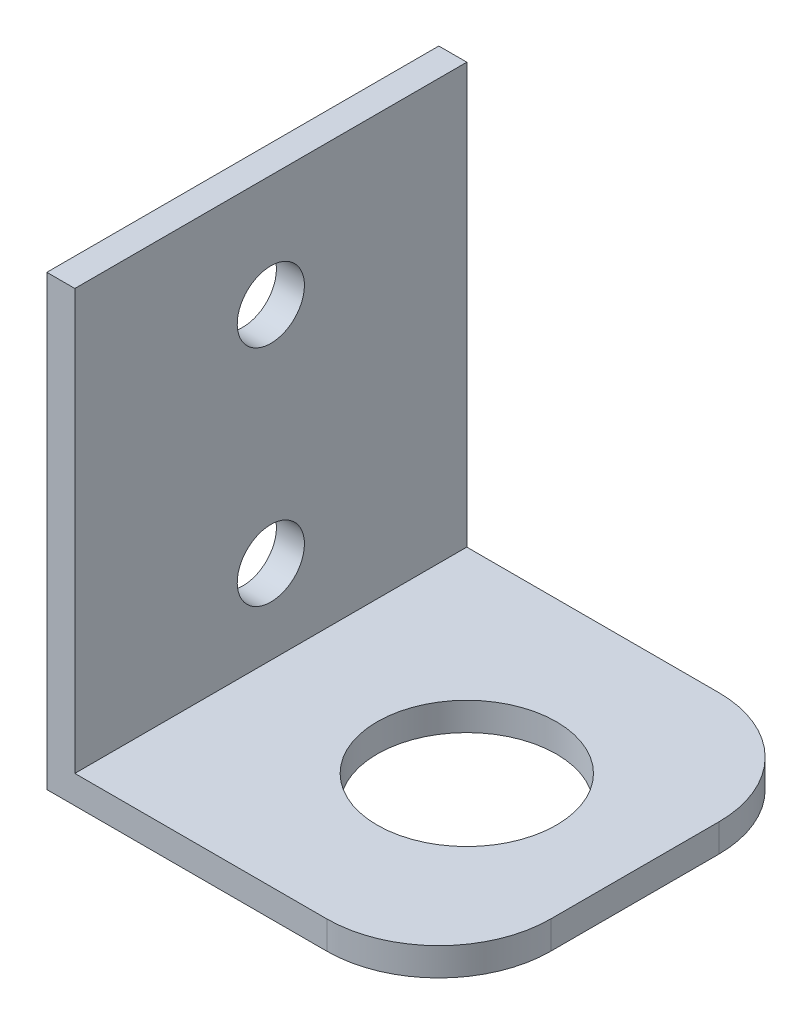
ISO-10303-21;
HEADER;
FILE_DESCRIPTION(('STEP AP214'),'2;1');
FILE_NAME('part.step','',(''),(''),'','','');
FILE_SCHEMA(('AUTOMOTIVE_DESIGN { 1 0 10303 214 1 1 1 1 }'));
ENDSEC;
DATA;
#1=APPLICATION_CONTEXT('core data for automotive mechanical design processes');
#2=APPLICATION_PROTOCOL_DEFINITION('international standard','automotive_design',2000,#1);
#3=PRODUCT_CONTEXT('',#1,'mechanical');
#4=PRODUCT('Part','Part','',(#3));
#5=PRODUCT_RELATED_PRODUCT_CATEGORY('part','',(#4));
#6=PRODUCT_DEFINITION_FORMATION('','',#4);
#7=PRODUCT_DEFINITION_CONTEXT('part definition',#1,'design');
#8=PRODUCT_DEFINITION('design','',#6,#7);
#9=PRODUCT_DEFINITION_SHAPE('','',#8);
#10=(LENGTH_UNIT() NAMED_UNIT(*) SI_UNIT(.MILLI.,.METRE.));
#11=(NAMED_UNIT(*) PLANE_ANGLE_UNIT() SI_UNIT($,.RADIAN.));
#12=(NAMED_UNIT(*) SI_UNIT($,.STERADIAN.) SOLID_ANGLE_UNIT());
#13=UNCERTAINTY_MEASURE_WITH_UNIT(LENGTH_MEASURE(1.E-05),#10,'distance_accuracy_value','');
#14=(GEOMETRIC_REPRESENTATION_CONTEXT(3) GLOBAL_UNCERTAINTY_ASSIGNED_CONTEXT((#13)) GLOBAL_UNIT_ASSIGNED_CONTEXT((#10,
#11,#12)) REPRESENTATION_CONTEXT('',''));
#15=CARTESIAN_POINT('',(0.,0.,0.));
#16=DIRECTION('',(0.,0.,1.));
#17=DIRECTION('',(1.,0.,0.));
#18=AXIS2_PLACEMENT_3D('',#15,#16,#17);
#19=CARTESIAN_POINT('',(-2.5,0.,35.));
#20=DIRECTION('',(0.,-1.,0.));
#21=DIRECTION('',(0.,0.,-1.));
#22=AXIS2_PLACEMENT_3D('',#19,#20,#21);
#23=PLANE('',#22);
#24=DIRECTION('',(-1.,0.,0.));
#25=VECTOR('',#24,1.);
#26=CARTESIAN_POINT('',(-2.5,0.,0.));
#27=LINE('',#26,#25);
#28=CARTESIAN_POINT('',(0.,0.,0.));
#29=VERTEX_POINT('',#28);
#30=CARTESIAN_POINT('',(-2.5,0.,0.));
#31=VERTEX_POINT('',#30);
#32=EDGE_CURVE('E127',#29,#31,#27,.T.);
#33=ORIENTED_EDGE('',*,*,#32,.T.);
#34=DIRECTION('',(0.,0.,-1.));
#35=VECTOR('',#34,1.);
#36=CARTESIAN_POINT('',(-2.5,0.,35.));
#37=LINE('',#36,#35);
#38=CARTESIAN_POINT('',(-2.5,0.,35.));
#39=VERTEX_POINT('',#38);
#40=EDGE_CURVE('E109',#39,#31,#37,.T.);
#41=ORIENTED_EDGE('',*,*,#40,.F.);
#42=DIRECTION('',(-1.,0.,0.));
#43=VECTOR('',#42,1.);
#44=CARTESIAN_POINT('',(-2.5,0.,35.));
#45=LINE('',#44,#43);
#46=CARTESIAN_POINT('',(0.,0.,35.));
#47=VERTEX_POINT('',#46);
#48=EDGE_CURVE('E115',#47,#39,#45,.T.);
#49=ORIENTED_EDGE('',*,*,#48,.F.);
#50=DIRECTION('',(0.,0.,-1.));
#51=VECTOR('',#50,1.);
#52=CARTESIAN_POINT('',(0.,0.,35.));
#53=LINE('',#52,#51);
#54=EDGE_CURVE('E173',#47,#29,#53,.T.);
#55=ORIENTED_EDGE('',*,*,#54,.T.);
#56=EDGE_LOOP('',(#33,#41,#49,#55));
#57=FACE_BOUND('',#56,.T.);
#58=ADVANCED_FACE('F36',(#57),#23,.F.);
#59=CARTESIAN_POINT('',(-2.5,-40.,35.));
#60=DIRECTION('',(1.,0.,0.));
#61=DIRECTION('',(0.,0.,-1.));
#62=AXIS2_PLACEMENT_3D('',#59,#60,#61);
#63=PLANE('',#62);
#64=CARTESIAN_POINT('',(-2.5,-10.,17.5));
#65=DIRECTION('',(1.,0.,0.));
#66=DIRECTION('',(0.,0.,-1.));
#67=AXIS2_PLACEMENT_3D('',#64,#65,#66);
#68=CIRCLE('',#67,3.);
#69=CARTESIAN_POINT('',(-2.5,-10.,14.5));
#70=VERTEX_POINT('',#69);
#71=EDGE_CURVE('E233',#70,#70,#68,.T.);
#72=ORIENTED_EDGE('',*,*,#71,.T.);
#73=EDGE_LOOP('',(#72));
#74=FACE_BOUND('',#73,.T.);
#75=CARTESIAN_POINT('',(-2.5,-30.,17.5));
#76=DIRECTION('',(1.,0.,0.));
#77=DIRECTION('',(0.,0.,-1.));
#78=AXIS2_PLACEMENT_3D('',#75,#76,#77);
#79=CIRCLE('',#78,3.);
#80=CARTESIAN_POINT('',(-2.5,-30.,14.5));
#81=VERTEX_POINT('',#80);
#82=EDGE_CURVE('E234',#81,#81,#79,.T.);
#83=ORIENTED_EDGE('',*,*,#82,.T.);
#84=EDGE_LOOP('',(#83));
#85=FACE_BOUND('',#84,.T.);
#86=DIRECTION('',(0.,-1.,0.));
#87=VECTOR('',#86,1.);
#88=CARTESIAN_POINT('',(-2.5,-40.,0.));
#89=LINE('',#88,#87);
#90=CARTESIAN_POINT('',(-2.5,-40.,0.));
#91=VERTEX_POINT('',#90);
#92=EDGE_CURVE('E169',#31,#91,#89,.T.);
#93=ORIENTED_EDGE('',*,*,#92,.T.);
#94=DIRECTION('',(0.,0.,-1.));
#95=VECTOR('',#94,1.);
#96=CARTESIAN_POINT('',(-2.5,-40.,35.));
#97=LINE('',#96,#95);
#98=CARTESIAN_POINT('',(-2.5,-40.,35.));
#99=VERTEX_POINT('',#98);
#100=EDGE_CURVE('E112',#99,#91,#97,.T.);
#101=ORIENTED_EDGE('',*,*,#100,.F.);
#102=DIRECTION('',(0.,-1.,0.));
#103=VECTOR('',#102,1.);
#104=CARTESIAN_POINT('',(-2.5,-40.,35.));
#105=LINE('',#104,#103);
#106=EDGE_CURVE('E105',#39,#99,#105,.T.);
#107=ORIENTED_EDGE('',*,*,#106,.F.);
#108=ORIENTED_EDGE('',*,*,#40,.T.);
#109=EDGE_LOOP('',(#93,#101,#107,#108));
#110=FACE_BOUND('',#109,.T.);
#111=ADVANCED_FACE('F107',(#74,#85,#110),#63,.F.);
#112=CARTESIAN_POINT('',(32.5,-40.,35.));
#113=DIRECTION('',(0.,1.,0.));
#114=DIRECTION('',(-1.,0.,0.));
#115=AXIS2_PLACEMENT_3D('',#112,#113,#114);
#116=PLANE('',#115);
#117=CARTESIAN_POINT('',(17.5,-40.,17.5));
#118=DIRECTION('',(0.,-1.,0.));
#119=DIRECTION('',(1.,0.,0.));
#120=AXIS2_PLACEMENT_3D('',#117,#118,#119);
#121=CIRCLE('',#120,8.);
#122=CARTESIAN_POINT('',(25.5,-40.,17.5));
#123=VERTEX_POINT('',#122);
#124=EDGE_CURVE('E138',#123,#123,#121,.T.);
#125=ORIENTED_EDGE('',*,*,#124,.F.);
#126=EDGE_LOOP('',(#125));
#127=FACE_BOUND('',#126,.T.);
#128=DIRECTION('',(1.,0.,0.));
#129=VECTOR('',#128,1.);
#130=CARTESIAN_POINT('',(32.5,-40.,0.));
#131=LINE('',#130,#129);
#132=CARTESIAN_POINT('',(22.5,-40.,0.));
#133=VERTEX_POINT('',#132);
#134=EDGE_CURVE('E150',#91,#133,#131,.T.);
#135=ORIENTED_EDGE('',*,*,#134,.T.);
#136=CARTESIAN_POINT('',(22.5,-40.,10.));
#137=DIRECTION('',(0.,1.,0.));
#138=DIRECTION('',(-1.,0.,0.));
#139=AXIS2_PLACEMENT_3D('',#136,#137,#138);
#140=CIRCLE('',#139,10.);
#141=CARTESIAN_POINT('',(32.5,-40.,10.));
#142=VERTEX_POINT('',#141);
#143=EDGE_CURVE('E44',#133,#142,#140,.F.);
#144=ORIENTED_EDGE('',*,*,#143,.T.);
#145=DIRECTION('',(0.,0.,-1.));
#146=VECTOR('',#145,1.);
#147=CARTESIAN_POINT('',(32.5,-40.,35.));
#148=LINE('',#147,#146);
#149=CARTESIAN_POINT('',(32.5,-40.,25.));
#150=VERTEX_POINT('',#149);
#151=EDGE_CURVE('E132',#150,#142,#148,.T.);
#152=ORIENTED_EDGE('',*,*,#151,.F.);
#153=CARTESIAN_POINT('',(22.5,-40.,25.));
#154=DIRECTION('',(0.,1.,0.));
#155=DIRECTION('',(-1.,0.,0.));
#156=AXIS2_PLACEMENT_3D('',#153,#154,#155);
#157=CIRCLE('',#156,10.);
#158=CARTESIAN_POINT('',(22.5,-40.,35.));
#159=VERTEX_POINT('',#158);
#160=EDGE_CURVE('E51',#150,#159,#157,.F.);
#161=ORIENTED_EDGE('',*,*,#160,.T.);
#162=DIRECTION('',(1.,0.,0.));
#163=VECTOR('',#162,1.);
#164=CARTESIAN_POINT('',(32.5,-40.,35.));
#165=LINE('',#164,#163);
#166=EDGE_CURVE('E114',#99,#159,#165,.T.);
#167=ORIENTED_EDGE('',*,*,#166,.F.);
#168=ORIENTED_EDGE('',*,*,#100,.T.);
#169=EDGE_LOOP('',(#135,#144,#152,#161,#167,#168));
#170=FACE_BOUND('',#169,.T.);
#171=ADVANCED_FACE('F149',(#127,#170),#116,.F.);
#172=CARTESIAN_POINT('',(32.5,-37.5,35.));
#173=DIRECTION('',(-1.,0.,0.));
#174=DIRECTION('',(0.,0.,1.));
#175=AXIS2_PLACEMENT_3D('',#172,#173,#174);
#176=PLANE('',#175);
#177=ORIENTED_EDGE('',*,*,#151,.T.);
#178=DIRECTION('',(0.,1.,0.));
#179=VECTOR('',#178,1.);
#180=CARTESIAN_POINT('',(32.5,-37.5,10.));
#181=LINE('',#180,#179);
#182=CARTESIAN_POINT('',(32.5,-37.5,10.));
#183=VERTEX_POINT('',#182);
#184=EDGE_CURVE('E130',#142,#183,#181,.T.);
#185=ORIENTED_EDGE('',*,*,#184,.T.);
#186=DIRECTION('',(0.,0.,-1.));
#187=VECTOR('',#186,1.);
#188=CARTESIAN_POINT('',(32.5,-37.5,35.));
#189=LINE('',#188,#187);
#190=CARTESIAN_POINT('',(32.5,-37.5,25.));
#191=VERTEX_POINT('',#190);
#192=EDGE_CURVE('E158',#191,#183,#189,.T.);
#193=ORIENTED_EDGE('',*,*,#192,.F.);
#194=DIRECTION('',(0.,1.,0.));
#195=VECTOR('',#194,1.);
#196=CARTESIAN_POINT('',(32.5,-37.5,25.));
#197=LINE('',#196,#195);
#198=EDGE_CURVE('E128',#191,#150,#197,.F.);
#199=ORIENTED_EDGE('',*,*,#198,.T.);
#200=EDGE_LOOP('',(#177,#185,#193,#199));
#201=FACE_BOUND('',#200,.T.);
#202=ADVANCED_FACE('F154',(#201),#176,.F.);
#203=CARTESIAN_POINT('',(0.,-37.5,35.));
#204=DIRECTION('',(0.,-1.,0.));
#205=DIRECTION('',(1.,0.,0.));
#206=AXIS2_PLACEMENT_3D('',#203,#204,#205);
#207=PLANE('',#206);
#208=CARTESIAN_POINT('',(17.5,-37.5,17.5));
#209=DIRECTION('',(0.,-1.,0.));
#210=DIRECTION('',(1.,0.,0.));
#211=AXIS2_PLACEMENT_3D('',#208,#209,#210);
#212=CIRCLE('',#211,8.);
#213=CARTESIAN_POINT('',(25.5,-37.5,17.5));
#214=VERTEX_POINT('',#213);
#215=EDGE_CURVE('E136',#214,#214,#212,.T.);
#216=ORIENTED_EDGE('',*,*,#215,.T.);
#217=EDGE_LOOP('',(#216));
#218=FACE_BOUND('',#217,.T.);
#219=ORIENTED_EDGE('',*,*,#192,.T.);
#220=CARTESIAN_POINT('',(22.5,-37.5,10.));
#221=DIRECTION('',(0.,-1.,0.));
#222=DIRECTION('',(1.,0.,0.));
#223=AXIS2_PLACEMENT_3D('',#220,#221,#222);
#224=CIRCLE('',#223,10.);
#225=CARTESIAN_POINT('',(22.5,-37.5,0.));
#226=VERTEX_POINT('',#225);
#227=EDGE_CURVE('E144',#183,#226,#224,.F.);
#228=ORIENTED_EDGE('',*,*,#227,.T.);
#229=DIRECTION('',(-1.,0.,0.));
#230=VECTOR('',#229,1.);
#231=CARTESIAN_POINT('',(0.,-37.5,0.));
#232=LINE('',#231,#230);
#233=CARTESIAN_POINT('',(0.,-37.5,0.));
#234=VERTEX_POINT('',#233);
#235=EDGE_CURVE('E163',#226,#234,#232,.T.);
#236=ORIENTED_EDGE('',*,*,#235,.T.);
#237=DIRECTION('',(0.,0.,-1.));
#238=VECTOR('',#237,1.);
#239=CARTESIAN_POINT('',(0.,-37.5,35.));
#240=LINE('',#239,#238);
#241=CARTESIAN_POINT('',(0.,-37.5,35.));
#242=VERTEX_POINT('',#241);
#243=EDGE_CURVE('E175',#242,#234,#240,.T.);
#244=ORIENTED_EDGE('',*,*,#243,.F.);
#245=DIRECTION('',(-1.,0.,0.));
#246=VECTOR('',#245,1.);
#247=CARTESIAN_POINT('',(0.,-37.5,35.));
#248=LINE('',#247,#246);
#249=CARTESIAN_POINT('',(22.5,-37.5,35.));
#250=VERTEX_POINT('',#249);
#251=EDGE_CURVE('E180',#250,#242,#248,.T.);
#252=ORIENTED_EDGE('',*,*,#251,.F.);
#253=CARTESIAN_POINT('',(22.5,-37.5,25.));
#254=DIRECTION('',(0.,-1.,0.));
#255=DIRECTION('',(1.,0.,0.));
#256=AXIS2_PLACEMENT_3D('',#253,#254,#255);
#257=CIRCLE('',#256,10.);
#258=EDGE_CURVE('E142',#250,#191,#257,.F.);
#259=ORIENTED_EDGE('',*,*,#258,.T.);
#260=EDGE_LOOP('',(#219,#228,#236,#244,#252,#259));
#261=FACE_BOUND('',#260,.T.);
#262=ADVANCED_FACE('F161',(#218,#261),#207,.F.);
#263=CARTESIAN_POINT('',(0.,0.,35.));
#264=DIRECTION('',(-1.,0.,0.));
#265=DIRECTION('',(0.,-1.,0.));
#266=AXIS2_PLACEMENT_3D('',#263,#264,#265);
#267=PLANE('',#266);
#268=CARTESIAN_POINT('',(0.,-10.,17.5));
#269=DIRECTION('',(1.,0.,0.));
#270=DIRECTION('',(0.,1.,0.));
#271=AXIS2_PLACEMENT_3D('',#268,#269,#270);
#272=CIRCLE('',#271,3.);
#273=CARTESIAN_POINT('',(0.,-7.,17.5));
#274=VERTEX_POINT('',#273);
#275=EDGE_CURVE('E230',#274,#274,#272,.T.);
#276=ORIENTED_EDGE('',*,*,#275,.F.);
#277=EDGE_LOOP('',(#276));
#278=FACE_BOUND('',#277,.T.);
#279=CARTESIAN_POINT('',(0.,-30.,17.5));
#280=DIRECTION('',(1.,0.,0.));
#281=DIRECTION('',(0.,1.,0.));
#282=AXIS2_PLACEMENT_3D('',#279,#280,#281);
#283=CIRCLE('',#282,3.);
#284=CARTESIAN_POINT('',(0.,-27.,17.5));
#285=VERTEX_POINT('',#284);
#286=EDGE_CURVE('E241',#285,#285,#283,.T.);
#287=ORIENTED_EDGE('',*,*,#286,.F.);
#288=EDGE_LOOP('',(#287));
#289=FACE_BOUND('',#288,.T.);
#290=DIRECTION('',(0.,1.,0.));
#291=VECTOR('',#290,1.);
#292=CARTESIAN_POINT('',(0.,0.,0.));
#293=LINE('',#292,#291);
#294=EDGE_CURVE('E124',#234,#29,#293,.T.);
#295=ORIENTED_EDGE('',*,*,#294,.T.);
#296=ORIENTED_EDGE('',*,*,#54,.F.);
#297=DIRECTION('',(0.,1.,0.));
#298=VECTOR('',#297,1.);
#299=CARTESIAN_POINT('',(0.,0.,35.));
#300=LINE('',#299,#298);
#301=EDGE_CURVE('E120',#242,#47,#300,.T.);
#302=ORIENTED_EDGE('',*,*,#301,.F.);
#303=ORIENTED_EDGE('',*,*,#243,.T.);
#304=EDGE_LOOP('',(#295,#296,#302,#303));
#305=FACE_BOUND('',#304,.T.);
#306=ADVANCED_FACE('F178',(#278,#289,#305),#267,.F.);
#307=CARTESIAN_POINT('',(0.,0.,35.));
#308=DIRECTION('',(0.,0.,-1.));
#309=DIRECTION('',(-1.,0.,0.));
#310=AXIS2_PLACEMENT_3D('',#307,#308,#309);
#311=PLANE('',#310);
#312=ORIENTED_EDGE('',*,*,#166,.T.);
#313=DIRECTION('',(0.,1.,0.));
#314=VECTOR('',#313,1.);
#315=CARTESIAN_POINT('',(22.5,0.,35.));
#316=LINE('',#315,#314);
#317=EDGE_CURVE('E11',#159,#250,#316,.T.);
#318=ORIENTED_EDGE('',*,*,#317,.T.);
#319=ORIENTED_EDGE('',*,*,#251,.T.);
#320=ORIENTED_EDGE('',*,*,#301,.T.);
#321=ORIENTED_EDGE('',*,*,#48,.T.);
#322=ORIENTED_EDGE('',*,*,#106,.T.);
#323=EDGE_LOOP('',(#312,#318,#319,#320,#321,#322));
#324=FACE_BOUND('',#323,.T.);
#325=ADVANCED_FACE('F118',(#324),#311,.F.);
#326=CARTESIAN_POINT('',(0.,0.,0.));
#327=DIRECTION('',(0.,0.,-1.));
#328=DIRECTION('',(-1.,0.,0.));
#329=AXIS2_PLACEMENT_3D('',#326,#327,#328);
#330=PLANE('',#329);
#331=ORIENTED_EDGE('',*,*,#235,.F.);
#332=DIRECTION('',(0.,1.,0.));
#333=VECTOR('',#332,1.);
#334=CARTESIAN_POINT('',(22.5,-40.,0.));
#335=LINE('',#334,#333);
#336=EDGE_CURVE('E59',#226,#133,#335,.F.);
#337=ORIENTED_EDGE('',*,*,#336,.T.);
#338=ORIENTED_EDGE('',*,*,#134,.F.);
#339=ORIENTED_EDGE('',*,*,#92,.F.);
#340=ORIENTED_EDGE('',*,*,#32,.F.);
#341=ORIENTED_EDGE('',*,*,#294,.F.);
#342=EDGE_LOOP('',(#331,#337,#338,#339,#340,#341));
#343=FACE_BOUND('',#342,.T.);
#344=ADVANCED_FACE('F166',(#343),#330,.T.);
#345=CARTESIAN_POINT('',(17.5,-20.,17.5));
#346=DIRECTION('',(0.,-1.,0.));
#347=DIRECTION('',(1.,0.,0.));
#348=AXIS2_PLACEMENT_3D('',#345,#346,#347);
#349=CYLINDRICAL_SURFACE('',#348,8.);
#350=ORIENTED_EDGE('',*,*,#124,.T.);
#351=EDGE_LOOP('',(#350));
#352=FACE_BOUND('',#351,.T.);
#353=ORIENTED_EDGE('',*,*,#215,.F.);
#354=EDGE_LOOP('',(#353));
#355=FACE_BOUND('',#354,.T.);
#356=ADVANCED_FACE('F213',(#352,#355),#349,.F.);
#357=CARTESIAN_POINT('',(-20.,-30.,17.5));
#358=DIRECTION('',(1.,0.,0.));
#359=DIRECTION('',(0.,1.,0.));
#360=AXIS2_PLACEMENT_3D('',#357,#358,#359);
#361=CYLINDRICAL_SURFACE('',#360,3.);
#362=ORIENTED_EDGE('',*,*,#286,.T.);
#363=EDGE_LOOP('',(#362));
#364=FACE_BOUND('',#363,.T.);
#365=ORIENTED_EDGE('',*,*,#82,.F.);
#366=EDGE_LOOP('',(#365));
#367=FACE_BOUND('',#366,.T.);
#368=ADVANCED_FACE('F218',(#364,#367),#361,.F.);
#369=CARTESIAN_POINT('',(-20.,-10.,17.5));
#370=DIRECTION('',(1.,0.,0.));
#371=DIRECTION('',(0.,1.,0.));
#372=AXIS2_PLACEMENT_3D('',#369,#370,#371);
#373=CYLINDRICAL_SURFACE('',#372,3.);
#374=ORIENTED_EDGE('',*,*,#275,.T.);
#375=EDGE_LOOP('',(#374));
#376=FACE_BOUND('',#375,.T.);
#377=ORIENTED_EDGE('',*,*,#71,.F.);
#378=EDGE_LOOP('',(#377));
#379=FACE_BOUND('',#378,.T.);
#380=ADVANCED_FACE('F191',(#376,#379),#373,.F.);
#381=CARTESIAN_POINT('',(22.5,-37.5,10.));
#382=DIRECTION('',(0.,-1.,0.));
#383=DIRECTION('',(0.,0.,-1.));
#384=AXIS2_PLACEMENT_3D('',#381,#382,#383);
#385=CYLINDRICAL_SURFACE('',#384,10.);
#386=ORIENTED_EDGE('',*,*,#143,.F.);
#387=ORIENTED_EDGE('',*,*,#336,.F.);
#388=ORIENTED_EDGE('',*,*,#227,.F.);
#389=ORIENTED_EDGE('',*,*,#184,.F.);
#390=EDGE_LOOP('',(#386,#387,#388,#389));
#391=FACE_BOUND('',#390,.T.);
#392=ADVANCED_FACE('F159',(#391),#385,.T.);
#393=CARTESIAN_POINT('',(22.5,0.,25.));
#394=DIRECTION('',(0.,1.,0.));
#395=DIRECTION('',(0.,0.,1.));
#396=AXIS2_PLACEMENT_3D('',#393,#394,#395);
#397=CYLINDRICAL_SURFACE('',#396,10.);
#398=ORIENTED_EDGE('',*,*,#160,.F.);
#399=ORIENTED_EDGE('',*,*,#198,.F.);
#400=ORIENTED_EDGE('',*,*,#258,.F.);
#401=ORIENTED_EDGE('',*,*,#317,.F.);
#402=EDGE_LOOP('',(#398,#399,#400,#401));
#403=FACE_BOUND('',#402,.T.);
#404=ADVANCED_FACE('F38',(#403),#397,.T.);
#405=CLOSED_SHELL('',(#58,#111,#171,#202,#262,#306,#325,#344,#356,#368,#380,#392,#404));
#406=MANIFOLD_SOLID_BREP('B2',#405);
#407=ADVANCED_BREP_SHAPE_REPRESENTATION('',(#18,#406),#14);
#408=SHAPE_DEFINITION_REPRESENTATION(#9,#407);
ENDSEC;
END-ISO-10303-21;
